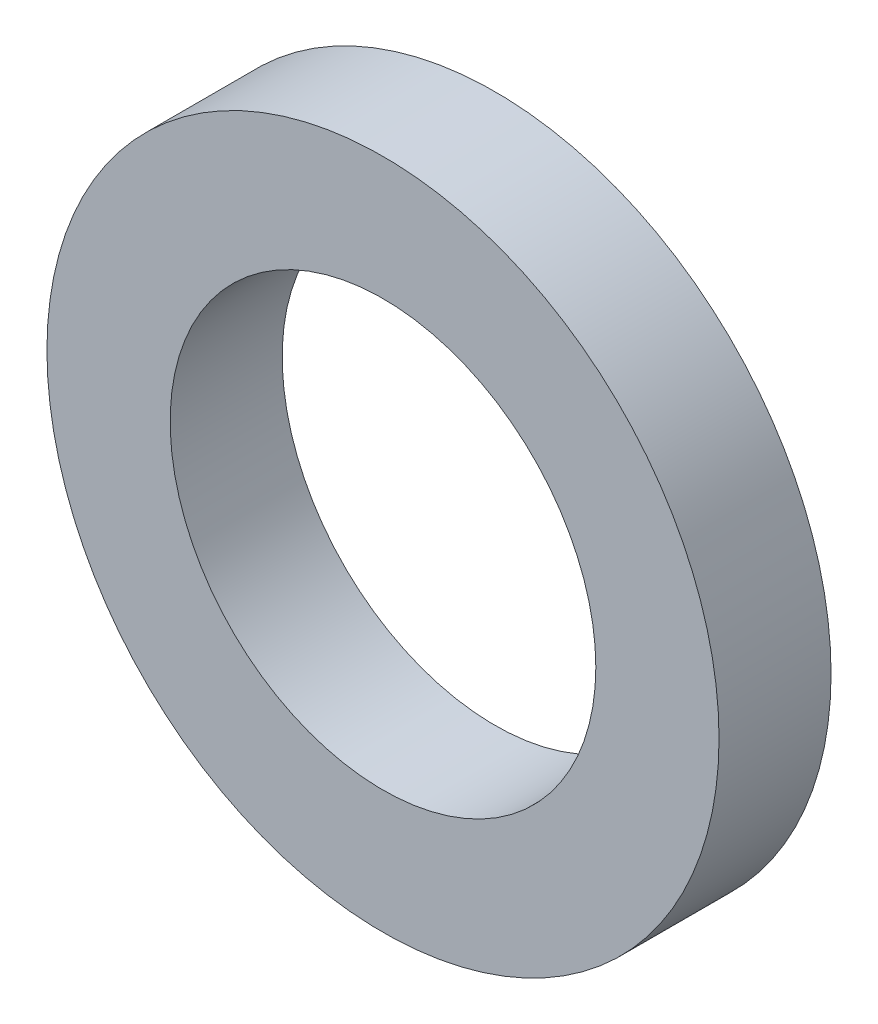
ISO-10303-21;
HEADER;
FILE_DESCRIPTION(('STEP AP214'),'2;1');
FILE_NAME('part.step','',(''),(''),'','','');
FILE_SCHEMA(('AUTOMOTIVE_DESIGN { 1 0 10303 214 1 1 1 1 }'));
ENDSEC;
DATA;
#1=APPLICATION_CONTEXT('core data for automotive mechanical design processes');
#2=APPLICATION_PROTOCOL_DEFINITION('international standard','automotive_design',2000,#1);
#3=PRODUCT_CONTEXT('',#1,'mechanical');
#4=PRODUCT('Part','Part','',(#3));
#5=PRODUCT_RELATED_PRODUCT_CATEGORY('part','',(#4));
#6=PRODUCT_DEFINITION_FORMATION('','',#4);
#7=PRODUCT_DEFINITION_CONTEXT('part definition',#1,'design');
#8=PRODUCT_DEFINITION('design','',#6,#7);
#9=PRODUCT_DEFINITION_SHAPE('','',#8);
#10=(LENGTH_UNIT() NAMED_UNIT(*) SI_UNIT(.MILLI.,.METRE.));
#11=(NAMED_UNIT(*) PLANE_ANGLE_UNIT() SI_UNIT($,.RADIAN.));
#12=(NAMED_UNIT(*) SI_UNIT($,.STERADIAN.) SOLID_ANGLE_UNIT());
#13=UNCERTAINTY_MEASURE_WITH_UNIT(LENGTH_MEASURE(1.E-05),#10,'distance_accuracy_value','');
#14=(GEOMETRIC_REPRESENTATION_CONTEXT(3) GLOBAL_UNCERTAINTY_ASSIGNED_CONTEXT((#13)) GLOBAL_UNIT_ASSIGNED_CONTEXT((#10,
#11,#12)) REPRESENTATION_CONTEXT('',''));
#15=CARTESIAN_POINT('',(0.,0.,0.));
#16=DIRECTION('',(0.,0.,1.));
#17=DIRECTION('',(1.,0.,0.));
#18=AXIS2_PLACEMENT_3D('',#15,#16,#17);
#19=CARTESIAN_POINT('',(0.,0.,0.5));
#20=DIRECTION('',(0.,0.,1.));
#21=DIRECTION('',(1.,0.,0.));
#22=AXIS2_PLACEMENT_3D('',#19,#20,#21);
#23=PLANE('',#22);
#24=CARTESIAN_POINT('',(0.,0.,0.5));
#25=DIRECTION('',(0.,0.,1.));
#26=DIRECTION('',(1.,0.,0.));
#27=AXIS2_PLACEMENT_3D('',#24,#25,#26);
#28=CIRCLE('',#27,3.);
#29=CARTESIAN_POINT('',(3.,0.,0.5));
#30=VERTEX_POINT('',#29);
#31=EDGE_CURVE('E10',#30,#30,#28,.T.);
#32=ORIENTED_EDGE('',*,*,#31,.T.);
#33=EDGE_LOOP('',(#32));
#34=FACE_BOUND('',#33,.T.);
#35=CARTESIAN_POINT('',(0.,0.,0.5));
#36=DIRECTION('',(0.,0.,1.));
#37=DIRECTION('',(1.,0.,0.));
#38=AXIS2_PLACEMENT_3D('',#35,#36,#37);
#39=CIRCLE('',#38,1.9);
#40=CARTESIAN_POINT('',(1.9,0.,0.5));
#41=VERTEX_POINT('',#40);
#42=EDGE_CURVE('E43',#41,#41,#39,.T.);
#43=ORIENTED_EDGE('',*,*,#42,.F.);
#44=EDGE_LOOP('',(#43));
#45=FACE_BOUND('',#44,.T.);
#46=ADVANCED_FACE('F32',(#34,#45),#23,.T.);
#47=CARTESIAN_POINT('',(0.,0.,-0.5));
#48=DIRECTION('',(0.,0.,1.));
#49=DIRECTION('',(1.,0.,0.));
#50=AXIS2_PLACEMENT_3D('',#47,#48,#49);
#51=PLANE('',#50);
#52=CARTESIAN_POINT('',(0.,0.,-0.5));
#53=DIRECTION('',(0.,0.,1.));
#54=DIRECTION('',(1.,0.,0.));
#55=AXIS2_PLACEMENT_3D('',#52,#53,#54);
#56=CIRCLE('',#55,3.);
#57=CARTESIAN_POINT('',(3.,0.,-0.5));
#58=VERTEX_POINT('',#57);
#59=EDGE_CURVE('E36',#58,#58,#56,.T.);
#60=ORIENTED_EDGE('',*,*,#59,.F.);
#61=EDGE_LOOP('',(#60));
#62=FACE_BOUND('',#61,.T.);
#63=CARTESIAN_POINT('',(0.,0.,-0.5));
#64=DIRECTION('',(0.,0.,1.));
#65=DIRECTION('',(1.,0.,0.));
#66=AXIS2_PLACEMENT_3D('',#63,#64,#65);
#67=CIRCLE('',#66,1.9);
#68=CARTESIAN_POINT('',(1.9,0.,-0.5));
#69=VERTEX_POINT('',#68);
#70=EDGE_CURVE('E45',#69,#69,#67,.T.);
#71=ORIENTED_EDGE('',*,*,#70,.T.);
#72=EDGE_LOOP('',(#71));
#73=FACE_BOUND('',#72,.T.);
#74=ADVANCED_FACE('F55',(#62,#73),#51,.F.);
#75=CARTESIAN_POINT('',(0.,0.,0.5));
#76=DIRECTION('',(0.,0.,-1.));
#77=DIRECTION('',(-1.,0.,0.));
#78=AXIS2_PLACEMENT_3D('',#75,#76,#77);
#79=CYLINDRICAL_SURFACE('',#78,3.);
#80=ORIENTED_EDGE('',*,*,#31,.F.);
#81=EDGE_LOOP('',(#80));
#82=FACE_BOUND('',#81,.T.);
#83=ORIENTED_EDGE('',*,*,#59,.T.);
#84=EDGE_LOOP('',(#83));
#85=FACE_BOUND('',#84,.T.);
#86=ADVANCED_FACE('F34',(#82,#85),#79,.T.);
#87=CARTESIAN_POINT('',(0.,0.,0.5));
#88=DIRECTION('',(0.,0.,-1.));
#89=DIRECTION('',(-1.,0.,0.));
#90=AXIS2_PLACEMENT_3D('',#87,#88,#89);
#91=CYLINDRICAL_SURFACE('',#90,1.9);
#92=ORIENTED_EDGE('',*,*,#42,.T.);
#93=EDGE_LOOP('',(#92));
#94=FACE_BOUND('',#93,.T.);
#95=ORIENTED_EDGE('',*,*,#70,.F.);
#96=EDGE_LOOP('',(#95));
#97=FACE_BOUND('',#96,.T.);
#98=ADVANCED_FACE('F51',(#94,#97),#91,.F.);
#99=CLOSED_SHELL('',(#46,#74,#86,#98));
#100=MANIFOLD_SOLID_BREP('B2',#99);
#101=ADVANCED_BREP_SHAPE_REPRESENTATION('',(#18,#100),#14);
#102=SHAPE_DEFINITION_REPRESENTATION(#9,#101);
ENDSEC;
END-ISO-10303-21;
